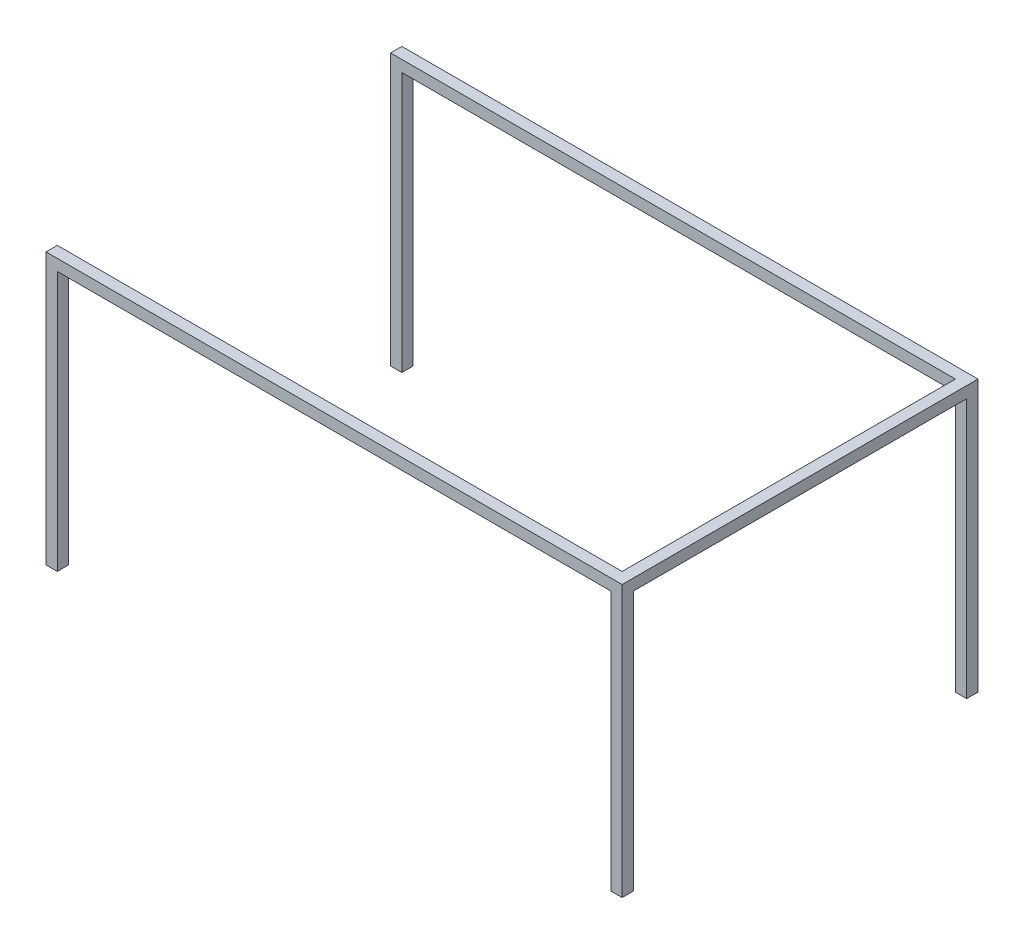
ISO-10303-21;
HEADER;
FILE_DESCRIPTION(('STEP AP214'),'2;1');
FILE_NAME('part.step','',(''),(''),'','','');
FILE_SCHEMA(('AUTOMOTIVE_DESIGN { 1 0 10303 214 1 1 1 1 }'));
ENDSEC;
DATA;
#1=APPLICATION_CONTEXT('core data for automotive mechanical design processes');
#2=APPLICATION_PROTOCOL_DEFINITION('international standard','automotive_design',2000,#1);
#3=PRODUCT_CONTEXT('',#1,'mechanical');
#4=PRODUCT('Part','Part','',(#3));
#5=PRODUCT_RELATED_PRODUCT_CATEGORY('part','',(#4));
#6=PRODUCT_DEFINITION_FORMATION('','',#4);
#7=PRODUCT_DEFINITION_CONTEXT('part definition',#1,'design');
#8=PRODUCT_DEFINITION('design','',#6,#7);
#9=PRODUCT_DEFINITION_SHAPE('','',#8);
#10=(LENGTH_UNIT() NAMED_UNIT(*) SI_UNIT(.MILLI.,.METRE.));
#11=(NAMED_UNIT(*) PLANE_ANGLE_UNIT() SI_UNIT($,.RADIAN.));
#12=(NAMED_UNIT(*) SI_UNIT($,.STERADIAN.) SOLID_ANGLE_UNIT());
#13=UNCERTAINTY_MEASURE_WITH_UNIT(LENGTH_MEASURE(1.E-05),#10,'distance_accuracy_value','');
#14=(GEOMETRIC_REPRESENTATION_CONTEXT(3) GLOBAL_UNCERTAINTY_ASSIGNED_CONTEXT((#13)) GLOBAL_UNIT_ASSIGNED_CONTEXT((#10,
#11,#12)) REPRESENTATION_CONTEXT('',''));
#15=CARTESIAN_POINT('',(0.,0.,0.));
#16=DIRECTION('',(0.,0.,1.));
#17=DIRECTION('',(1.,0.,0.));
#18=AXIS2_PLACEMENT_3D('',#15,#16,#17);
#19=CARTESIAN_POINT('',(0.,0.,0.));
#20=DIRECTION('',(0.,1.,0.));
#21=DIRECTION('',(0.,0.,1.));
#22=AXIS2_PLACEMENT_3D('',#19,#20,#21);
#23=PLANE('',#22);
#24=DIRECTION('',(0.,0.,1.));
#25=VECTOR('',#24,1.);
#26=CARTESIAN_POINT('',(774.7,0.,0.));
#27=LINE('',#26,#25);
#28=CARTESIAN_POINT('',(774.7,0.,-374.65));
#29=VERTEX_POINT('',#28);
#30=CARTESIAN_POINT('',(774.7,0.,374.65));
#31=VERTEX_POINT('',#30);
#32=EDGE_CURVE('E249',#29,#31,#27,.T.);
#33=ORIENTED_EDGE('',*,*,#32,.T.);
#34=DIRECTION('',(-1.,0.,0.));
#35=VECTOR('',#34,1.);
#36=CARTESIAN_POINT('',(774.7,0.,374.65));
#37=LINE('',#36,#35);
#38=CARTESIAN_POINT('',(749.3,0.,374.65));
#39=VERTEX_POINT('',#38);
#40=EDGE_CURVE('E241',#31,#39,#37,.T.);
#41=ORIENTED_EDGE('',*,*,#40,.T.);
#42=DIRECTION('',(0.,0.,-1.));
#43=VECTOR('',#42,1.);
#44=CARTESIAN_POINT('',(749.3,0.,0.));
#45=LINE('',#44,#43);
#46=CARTESIAN_POINT('',(749.3,0.,-374.65));
#47=VERTEX_POINT('',#46);
#48=EDGE_CURVE('E226',#39,#47,#45,.T.);
#49=ORIENTED_EDGE('',*,*,#48,.T.);
#50=DIRECTION('',(1.,0.,0.));
#51=VECTOR('',#50,1.);
#52=CARTESIAN_POINT('',(774.7,0.,-374.65));
#53=LINE('',#52,#51);
#54=EDGE_CURVE('E201',#47,#29,#53,.T.);
#55=ORIENTED_EDGE('',*,*,#54,.T.);
#56=EDGE_LOOP('',(#33,#41,#49,#55));
#57=FACE_BOUND('',#56,.T.);
#58=ADVANCED_FACE('F72',(#57),#23,.F.);
#59=DIRECTION('',(1.,0.,0.));
#60=VECTOR('',#59,1.);
#61=CARTESIAN_POINT('',(0.,0.,-400.05));
#62=LINE('',#61,#60);
#63=CARTESIAN_POINT('',(-495.3,0.,-400.05));
#64=VERTEX_POINT('',#63);
#65=CARTESIAN_POINT('',(749.3,0.,-400.05));
#66=VERTEX_POINT('',#65);
#67=EDGE_CURVE('E218',#64,#66,#62,.T.);
#68=ORIENTED_EDGE('',*,*,#67,.T.);
#69=DIRECTION('',(0.,0.,1.));
#70=VECTOR('',#69,1.);
#71=CARTESIAN_POINT('',(749.3,0.,-400.05));
#72=LINE('',#71,#70);
#73=EDGE_CURVE('E198',#66,#47,#72,.T.);
#74=ORIENTED_EDGE('',*,*,#73,.T.);
#75=DIRECTION('',(-1.,0.,0.));
#76=VECTOR('',#75,1.);
#77=CARTESIAN_POINT('',(749.3,0.,-374.65));
#78=LINE('',#77,#76);
#79=CARTESIAN_POINT('',(-495.3,0.,-374.65));
#80=VERTEX_POINT('',#79);
#81=EDGE_CURVE('E220',#47,#80,#78,.T.);
#82=ORIENTED_EDGE('',*,*,#81,.T.);
#83=DIRECTION('',(0.,0.,-1.));
#84=VECTOR('',#83,1.);
#85=CARTESIAN_POINT('',(-495.3,0.,-400.05));
#86=LINE('',#85,#84);
#87=EDGE_CURVE('E219',#80,#64,#86,.T.);
#88=ORIENTED_EDGE('',*,*,#87,.T.);
#89=EDGE_LOOP('',(#68,#74,#82,#88));
#90=FACE_BOUND('',#89,.T.);
#91=ADVANCED_FACE('F212',(#90),#23,.F.);
#92=CARTESIAN_POINT('',(-520.7,25.4,0.));
#93=DIRECTION('',(1.,0.,0.));
#94=DIRECTION('',(0.,0.,-1.));
#95=AXIS2_PLACEMENT_3D('',#92,#93,#94);
#96=PLANE('',#95);
#97=DIRECTION('',(0.,-1.,0.));
#98=VECTOR('',#97,1.);
#99=CARTESIAN_POINT('',(-520.7,25.4,374.65));
#100=LINE('',#99,#98);
#101=CARTESIAN_POINT('',(-520.7,25.4,374.65));
#102=VERTEX_POINT('',#101);
#103=CARTESIAN_POINT('',(-520.7,-584.2,374.65));
#104=VERTEX_POINT('',#103);
#105=EDGE_CURVE('E79',#102,#104,#100,.T.);
#106=ORIENTED_EDGE('',*,*,#105,.T.);
#107=DIRECTION('',(0.,0.,1.));
#108=VECTOR('',#107,1.);
#109=CARTESIAN_POINT('',(-520.7,-584.2,400.05));
#110=LINE('',#109,#108);
#111=CARTESIAN_POINT('',(-520.7,-584.2,400.05));
#112=VERTEX_POINT('',#111);
#113=EDGE_CURVE('E309',#104,#112,#110,.T.);
#114=ORIENTED_EDGE('',*,*,#113,.T.);
#115=DIRECTION('',(0.,-1.,0.));
#116=VECTOR('',#115,1.);
#117=CARTESIAN_POINT('',(-520.7,25.4,400.05));
#118=LINE('',#117,#116);
#119=CARTESIAN_POINT('',(-520.7,25.4,400.05));
#120=VERTEX_POINT('',#119);
#121=EDGE_CURVE('E256',#120,#112,#118,.T.);
#122=ORIENTED_EDGE('',*,*,#121,.F.);
#123=DIRECTION('',(0.,0.,1.));
#124=VECTOR('',#123,1.);
#125=CARTESIAN_POINT('',(-520.7,25.4,0.));
#126=LINE('',#125,#124);
#127=EDGE_CURVE('E246',#102,#120,#126,.T.);
#128=ORIENTED_EDGE('',*,*,#127,.F.);
#129=EDGE_LOOP('',(#106,#114,#122,#128));
#130=FACE_BOUND('',#129,.T.);
#131=ADVANCED_FACE('F384',(#130),#96,.F.);
#132=CARTESIAN_POINT('',(0.,25.4,400.05));
#133=DIRECTION('',(0.,0.,1.));
#134=DIRECTION('',(1.,0.,0.));
#135=AXIS2_PLACEMENT_3D('',#132,#133,#134);
#136=PLANE('',#135);
#137=DIRECTION('',(-1.,0.,0.));
#138=VECTOR('',#137,1.);
#139=CARTESIAN_POINT('',(0.,0.,400.05));
#140=LINE('',#139,#138);
#141=CARTESIAN_POINT('',(749.3,0.,400.05));
#142=VERTEX_POINT('',#141);
#143=CARTESIAN_POINT('',(-495.3,0.,400.05));
#144=VERTEX_POINT('',#143);
#145=EDGE_CURVE('E275',#142,#144,#140,.T.);
#146=ORIENTED_EDGE('',*,*,#145,.F.);
#147=DIRECTION('',(0.,1.,0.));
#148=VECTOR('',#147,1.);
#149=CARTESIAN_POINT('',(749.3,-584.2,400.05));
#150=LINE('',#149,#148);
#151=CARTESIAN_POINT('',(749.3,-584.2,400.05));
#152=VERTEX_POINT('',#151);
#153=EDGE_CURVE('E86',#152,#142,#150,.T.);
#154=ORIENTED_EDGE('',*,*,#153,.F.);
#155=DIRECTION('',(1.,0.,0.));
#156=VECTOR('',#155,1.);
#157=CARTESIAN_POINT('',(774.7,-584.2,400.05));
#158=LINE('',#157,#156);
#159=CARTESIAN_POINT('',(774.7,-584.2,400.05));
#160=VERTEX_POINT('',#159);
#161=EDGE_CURVE('E297',#152,#160,#158,.T.);
#162=ORIENTED_EDGE('',*,*,#161,.T.);
#163=DIRECTION('',(0.,-1.,0.));
#164=VECTOR('',#163,1.);
#165=CARTESIAN_POINT('',(774.7,25.4,400.05));
#166=LINE('',#165,#164);
#167=CARTESIAN_POINT('',(774.7,25.4,400.05));
#168=VERTEX_POINT('',#167);
#169=EDGE_CURVE('E258',#168,#160,#166,.T.);
#170=ORIENTED_EDGE('',*,*,#169,.F.);
#171=DIRECTION('',(-1.,0.,0.));
#172=VECTOR('',#171,1.);
#173=CARTESIAN_POINT('',(0.,25.4,400.05));
#174=LINE('',#173,#172);
#175=EDGE_CURVE('E341',#168,#120,#174,.T.);
#176=ORIENTED_EDGE('',*,*,#175,.T.);
#177=ORIENTED_EDGE('',*,*,#121,.T.);
#178=DIRECTION('',(1.,0.,0.));
#179=VECTOR('',#178,1.);
#180=CARTESIAN_POINT('',(-520.7,-584.2,400.05));
#181=LINE('',#180,#179);
#182=CARTESIAN_POINT('',(-495.3,-584.2,400.05));
#183=VERTEX_POINT('',#182);
#184=EDGE_CURVE('E316',#112,#183,#181,.T.);
#185=ORIENTED_EDGE('',*,*,#184,.T.);
#186=DIRECTION('',(0.,1.,0.));
#187=VECTOR('',#186,1.);
#188=CARTESIAN_POINT('',(-495.3,-584.2,400.05));
#189=LINE('',#188,#187);
#190=EDGE_CURVE('E306',#183,#144,#189,.T.);
#191=ORIENTED_EDGE('',*,*,#190,.T.);
#192=EDGE_LOOP('',(#146,#154,#162,#170,#176,#177,#185,#191));
#193=FACE_BOUND('',#192,.T.);
#194=ADVANCED_FACE('F398',(#193),#136,.T.);
#195=CARTESIAN_POINT('',(774.7,25.4,0.));
#196=DIRECTION('',(1.,0.,0.));
#197=DIRECTION('',(0.,0.,-1.));
#198=AXIS2_PLACEMENT_3D('',#195,#196,#197);
#199=PLANE('',#198);
#200=ORIENTED_EDGE('',*,*,#32,.F.);
#201=DIRECTION('',(0.,1.,0.));
#202=VECTOR('',#201,1.);
#203=CARTESIAN_POINT('',(774.7,-584.2,-374.65));
#204=LINE('',#203,#202);
#205=CARTESIAN_POINT('',(774.7,-584.2,-374.65));
#206=VERTEX_POINT('',#205);
#207=EDGE_CURVE('E96',#206,#29,#204,.T.);
#208=ORIENTED_EDGE('',*,*,#207,.F.);
#209=DIRECTION('',(0.,0.,-1.));
#210=VECTOR('',#209,1.);
#211=CARTESIAN_POINT('',(774.7,-584.2,-400.05));
#212=LINE('',#211,#210);
#213=CARTESIAN_POINT('',(774.7,-584.2,-400.05));
#214=VERTEX_POINT('',#213);
#215=EDGE_CURVE('E207',#206,#214,#212,.T.);
#216=ORIENTED_EDGE('',*,*,#215,.T.);
#217=DIRECTION('',(0.,-1.,0.));
#218=VECTOR('',#217,1.);
#219=CARTESIAN_POINT('',(774.7,25.4,-400.05));
#220=LINE('',#219,#218);
#221=CARTESIAN_POINT('',(774.7,25.4,-400.05));
#222=VERTEX_POINT('',#221);
#223=EDGE_CURVE('E255',#222,#214,#220,.T.);
#224=ORIENTED_EDGE('',*,*,#223,.F.);
#225=DIRECTION('',(0.,0.,1.));
#226=VECTOR('',#225,1.);
#227=CARTESIAN_POINT('',(774.7,25.4,0.));
#228=LINE('',#227,#226);
#229=EDGE_CURVE('E343',#222,#168,#228,.T.);
#230=ORIENTED_EDGE('',*,*,#229,.T.);
#231=ORIENTED_EDGE('',*,*,#169,.T.);
#232=DIRECTION('',(0.,0.,-1.));
#233=VECTOR('',#232,1.);
#234=CARTESIAN_POINT('',(774.7,-584.2,400.05));
#235=LINE('',#234,#233);
#236=CARTESIAN_POINT('',(774.7,-584.2,374.65));
#237=VERTEX_POINT('',#236);
#238=EDGE_CURVE('E287',#160,#237,#235,.T.);
#239=ORIENTED_EDGE('',*,*,#238,.T.);
#240=DIRECTION('',(0.,1.,0.));
#241=VECTOR('',#240,1.);
#242=CARTESIAN_POINT('',(774.7,-584.2,374.65));
#243=LINE('',#242,#241);
#244=EDGE_CURVE('E284',#237,#31,#243,.T.);
#245=ORIENTED_EDGE('',*,*,#244,.T.);
#246=EDGE_LOOP('',(#200,#208,#216,#224,#230,#231,#239,#245));
#247=FACE_BOUND('',#246,.T.);
#248=ADVANCED_FACE('F281',(#247),#199,.T.);
#249=CARTESIAN_POINT('',(0.,25.4,-400.05));
#250=DIRECTION('',(0.,0.,-1.));
#251=DIRECTION('',(-1.,0.,0.));
#252=AXIS2_PLACEMENT_3D('',#249,#250,#251);
#253=PLANE('',#252);
#254=ORIENTED_EDGE('',*,*,#67,.F.);
#255=DIRECTION('',(0.,1.,0.));
#256=VECTOR('',#255,1.);
#257=CARTESIAN_POINT('',(-495.3,-584.2,-400.05));
#258=LINE('',#257,#256);
#259=CARTESIAN_POINT('',(-495.3,-584.2,-400.05));
#260=VERTEX_POINT('',#259);
#261=EDGE_CURVE('E240',#260,#64,#258,.T.);
#262=ORIENTED_EDGE('',*,*,#261,.F.);
#263=DIRECTION('',(-1.,0.,0.));
#264=VECTOR('',#263,1.);
#265=CARTESIAN_POINT('',(-520.7,-584.2,-400.05));
#266=LINE('',#265,#264);
#267=CARTESIAN_POINT('',(-520.7,-584.2,-400.05));
#268=VERTEX_POINT('',#267);
#269=EDGE_CURVE('E331',#260,#268,#266,.T.);
#270=ORIENTED_EDGE('',*,*,#269,.T.);
#271=DIRECTION('',(0.,-1.,0.));
#272=VECTOR('',#271,1.);
#273=CARTESIAN_POINT('',(-520.7,25.4,-400.05));
#274=LINE('',#273,#272);
#275=CARTESIAN_POINT('',(-520.7,25.4,-400.05));
#276=VERTEX_POINT('',#275);
#277=EDGE_CURVE('E73',#276,#268,#274,.T.);
#278=ORIENTED_EDGE('',*,*,#277,.F.);
#279=DIRECTION('',(1.,0.,0.));
#280=VECTOR('',#279,1.);
#281=CARTESIAN_POINT('',(0.,25.4,-400.05));
#282=LINE('',#281,#280);
#283=EDGE_CURVE('E347',#276,#222,#282,.T.);
#284=ORIENTED_EDGE('',*,*,#283,.T.);
#285=ORIENTED_EDGE('',*,*,#223,.T.);
#286=DIRECTION('',(-1.,0.,0.));
#287=VECTOR('',#286,1.);
#288=CARTESIAN_POINT('',(774.7,-584.2,-400.05));
#289=LINE('',#288,#287);
#290=CARTESIAN_POINT('',(749.3,-584.2,-400.05));
#291=VERTEX_POINT('',#290);
#292=EDGE_CURVE('E359',#214,#291,#289,.T.);
#293=ORIENTED_EDGE('',*,*,#292,.T.);
#294=DIRECTION('',(0.,1.,0.));
#295=VECTOR('',#294,1.);
#296=CARTESIAN_POINT('',(749.3,-584.2,-400.05));
#297=LINE('',#296,#295);
#298=EDGE_CURVE('E203',#291,#66,#297,.T.);
#299=ORIENTED_EDGE('',*,*,#298,.T.);
#300=EDGE_LOOP('',(#254,#262,#270,#278,#284,#285,#293,#299));
#301=FACE_BOUND('',#300,.T.);
#302=ADVANCED_FACE('F349',(#301),#253,.T.);
#303=CARTESIAN_POINT('',(749.3,25.4,0.));
#304=DIRECTION('',(-1.,0.,0.));
#305=DIRECTION('',(0.,0.,1.));
#306=AXIS2_PLACEMENT_3D('',#303,#304,#305);
#307=PLANE('',#306);
#308=DIRECTION('',(0.,1.,0.));
#309=VECTOR('',#308,1.);
#310=CARTESIAN_POINT('',(749.3,25.4,-374.65));
#311=LINE('',#310,#309);
#312=CARTESIAN_POINT('',(749.3,25.4,-374.65));
#313=VERTEX_POINT('',#312);
#314=EDGE_CURVE('E12',#47,#313,#311,.T.);
#315=ORIENTED_EDGE('',*,*,#314,.F.);
#316=ORIENTED_EDGE('',*,*,#48,.F.);
#317=DIRECTION('',(0.,-1.,0.));
#318=VECTOR('',#317,1.);
#319=CARTESIAN_POINT('',(749.3,25.4,374.65));
#320=LINE('',#319,#318);
#321=CARTESIAN_POINT('',(749.3,25.4,374.65));
#322=VERTEX_POINT('',#321);
#323=EDGE_CURVE('E252',#322,#39,#320,.T.);
#324=ORIENTED_EDGE('',*,*,#323,.F.);
#325=DIRECTION('',(0.,0.,-1.));
#326=VECTOR('',#325,1.);
#327=CARTESIAN_POINT('',(749.3,25.4,0.));
#328=LINE('',#327,#326);
#329=EDGE_CURVE('E227',#322,#313,#328,.T.);
#330=ORIENTED_EDGE('',*,*,#329,.T.);
#331=EDGE_LOOP('',(#315,#316,#324,#330));
#332=FACE_BOUND('',#331,.T.);
#333=ADVANCED_FACE('F223',(#332),#307,.T.);
#334=CARTESIAN_POINT('',(0.,25.4,374.65));
#335=DIRECTION('',(0.,0.,1.));
#336=DIRECTION('',(1.,0.,0.));
#337=AXIS2_PLACEMENT_3D('',#334,#335,#336);
#338=PLANE('',#337);
#339=DIRECTION('',(-1.,0.,0.));
#340=VECTOR('',#339,1.);
#341=CARTESIAN_POINT('',(0.,0.,374.65));
#342=LINE('',#341,#340);
#343=CARTESIAN_POINT('',(-495.3,0.,374.65));
#344=VERTEX_POINT('',#343);
#345=EDGE_CURVE('E266',#39,#344,#342,.T.);
#346=ORIENTED_EDGE('',*,*,#345,.T.);
#347=DIRECTION('',(0.,1.,0.));
#348=VECTOR('',#347,1.);
#349=CARTESIAN_POINT('',(-495.3,-584.2,374.65));
#350=LINE('',#349,#348);
#351=CARTESIAN_POINT('',(-495.3,-584.2,374.65));
#352=VERTEX_POINT('',#351);
#353=EDGE_CURVE('E313',#352,#344,#350,.T.);
#354=ORIENTED_EDGE('',*,*,#353,.F.);
#355=DIRECTION('',(-1.,0.,0.));
#356=VECTOR('',#355,1.);
#357=CARTESIAN_POINT('',(-520.7,-584.2,374.65));
#358=LINE('',#357,#356);
#359=EDGE_CURVE('E317',#352,#104,#358,.T.);
#360=ORIENTED_EDGE('',*,*,#359,.T.);
#361=ORIENTED_EDGE('',*,*,#105,.F.);
#362=DIRECTION('',(-1.,0.,0.));
#363=VECTOR('',#362,1.);
#364=CARTESIAN_POINT('',(0.,25.4,374.65));
#365=LINE('',#364,#363);
#366=EDGE_CURVE('E242',#322,#102,#365,.T.);
#367=ORIENTED_EDGE('',*,*,#366,.F.);
#368=ORIENTED_EDGE('',*,*,#323,.T.);
#369=EDGE_LOOP('',(#346,#354,#360,#361,#367,#368));
#370=FACE_BOUND('',#369,.T.);
#371=ADVANCED_FACE('F386',(#370),#338,.F.);
#372=ORIENTED_EDGE('',*,*,#145,.T.);
#373=DIRECTION('',(0.,0.,-1.));
#374=VECTOR('',#373,1.);
#375=CARTESIAN_POINT('',(-495.3,0.,400.05));
#376=LINE('',#375,#374);
#377=EDGE_CURVE('E311',#144,#344,#376,.T.);
#378=ORIENTED_EDGE('',*,*,#377,.T.);
#379=ORIENTED_EDGE('',*,*,#345,.F.);
#380=DIRECTION('',(0.,0.,1.));
#381=VECTOR('',#380,1.);
#382=CARTESIAN_POINT('',(749.3,0.,400.05));
#383=LINE('',#382,#381);
#384=EDGE_CURVE('E293',#39,#142,#383,.T.);
#385=ORIENTED_EDGE('',*,*,#384,.T.);
#386=EDGE_LOOP('',(#372,#378,#379,#385));
#387=FACE_BOUND('',#386,.T.);
#388=ADVANCED_FACE('F379',(#387),#23,.F.);
#389=CARTESIAN_POINT('',(0.,25.4,0.));
#390=DIRECTION('',(0.,1.,0.));
#391=DIRECTION('',(0.,0.,1.));
#392=AXIS2_PLACEMENT_3D('',#389,#390,#391);
#393=PLANE('',#392);
#394=ORIENTED_EDGE('',*,*,#366,.T.);
#395=ORIENTED_EDGE('',*,*,#127,.T.);
#396=ORIENTED_EDGE('',*,*,#175,.F.);
#397=ORIENTED_EDGE('',*,*,#229,.F.);
#398=ORIENTED_EDGE('',*,*,#283,.F.);
#399=DIRECTION('',(0.,0.,-1.));
#400=VECTOR('',#399,1.);
#401=CARTESIAN_POINT('',(-520.7,25.4,-374.65));
#402=LINE('',#401,#400);
#403=CARTESIAN_POINT('',(-520.7,25.4,-374.65));
#404=VERTEX_POINT('',#403);
#405=EDGE_CURVE('E237',#404,#276,#402,.T.);
#406=ORIENTED_EDGE('',*,*,#405,.F.);
#407=DIRECTION('',(-1.,0.,0.));
#408=VECTOR('',#407,1.);
#409=CARTESIAN_POINT('',(749.3,25.4,-374.65));
#410=LINE('',#409,#408);
#411=EDGE_CURVE('E263',#313,#404,#410,.T.);
#412=ORIENTED_EDGE('',*,*,#411,.F.);
#413=ORIENTED_EDGE('',*,*,#329,.F.);
#414=EDGE_LOOP('',(#394,#395,#396,#397,#398,#406,#412,#413));
#415=FACE_BOUND('',#414,.T.);
#416=ADVANCED_FACE('F354',(#415),#393,.T.);
#417=CARTESIAN_POINT('',(-520.7,25.4,-374.65));
#418=DIRECTION('',(-1.,0.,0.));
#419=DIRECTION('',(0.,0.,1.));
#420=AXIS2_PLACEMENT_3D('',#417,#418,#419);
#421=PLANE('',#420);
#422=ORIENTED_EDGE('',*,*,#277,.T.);
#423=DIRECTION('',(0.,0.,1.));
#424=VECTOR('',#423,1.);
#425=CARTESIAN_POINT('',(-520.7,-584.2,-400.05));
#426=LINE('',#425,#424);
#427=CARTESIAN_POINT('',(-520.7,-584.2,-374.65));
#428=VERTEX_POINT('',#427);
#429=EDGE_CURVE('E330',#268,#428,#426,.T.);
#430=ORIENTED_EDGE('',*,*,#429,.T.);
#431=DIRECTION('',(0.,-1.,0.));
#432=VECTOR('',#431,1.);
#433=CARTESIAN_POINT('',(-520.7,25.4,-374.65));
#434=LINE('',#433,#432);
#435=EDGE_CURVE('E262',#404,#428,#434,.T.);
#436=ORIENTED_EDGE('',*,*,#435,.F.);
#437=ORIENTED_EDGE('',*,*,#405,.T.);
#438=EDGE_LOOP('',(#422,#430,#436,#437));
#439=FACE_BOUND('',#438,.T.);
#440=ADVANCED_FACE('F71',(#439),#421,.T.);
#441=CARTESIAN_POINT('',(749.3,25.4,-374.65));
#442=DIRECTION('',(0.,0.,1.));
#443=DIRECTION('',(1.,0.,0.));
#444=AXIS2_PLACEMENT_3D('',#441,#442,#443);
#445=PLANE('',#444);
#446=ORIENTED_EDGE('',*,*,#81,.F.);
#447=ORIENTED_EDGE('',*,*,#314,.T.);
#448=ORIENTED_EDGE('',*,*,#411,.T.);
#449=ORIENTED_EDGE('',*,*,#435,.T.);
#450=DIRECTION('',(1.,0.,0.));
#451=VECTOR('',#450,1.);
#452=CARTESIAN_POINT('',(-520.7,-584.2,-374.65));
#453=LINE('',#452,#451);
#454=CARTESIAN_POINT('',(-495.3,-584.2,-374.65));
#455=VERTEX_POINT('',#454);
#456=EDGE_CURVE('E328',#428,#455,#453,.T.);
#457=ORIENTED_EDGE('',*,*,#456,.T.);
#458=DIRECTION('',(0.,1.,0.));
#459=VECTOR('',#458,1.);
#460=CARTESIAN_POINT('',(-495.3,-584.2,-374.65));
#461=LINE('',#460,#459);
#462=EDGE_CURVE('E233',#455,#80,#461,.T.);
#463=ORIENTED_EDGE('',*,*,#462,.T.);
#464=EDGE_LOOP('',(#446,#447,#448,#449,#457,#463));
#465=FACE_BOUND('',#464,.T.);
#466=ADVANCED_FACE('F232',(#465),#445,.T.);
#467=CARTESIAN_POINT('',(-495.3,-584.2,-400.05));
#468=DIRECTION('',(1.,0.,0.));
#469=DIRECTION('',(0.,0.,-1.));
#470=AXIS2_PLACEMENT_3D('',#467,#468,#469);
#471=PLANE('',#470);
#472=ORIENTED_EDGE('',*,*,#87,.F.);
#473=ORIENTED_EDGE('',*,*,#462,.F.);
#474=DIRECTION('',(0.,0.,-1.));
#475=VECTOR('',#474,1.);
#476=CARTESIAN_POINT('',(-495.3,-584.2,-400.05));
#477=LINE('',#476,#475);
#478=EDGE_CURVE('E332',#455,#260,#477,.T.);
#479=ORIENTED_EDGE('',*,*,#478,.T.);
#480=ORIENTED_EDGE('',*,*,#261,.T.);
#481=EDGE_LOOP('',(#472,#473,#479,#480));
#482=FACE_BOUND('',#481,.T.);
#483=ADVANCED_FACE('F427',(#482),#471,.T.);
#484=CARTESIAN_POINT('',(0.,-584.2,0.));
#485=DIRECTION('',(0.,1.,0.));
#486=DIRECTION('',(0.,0.,1.));
#487=AXIS2_PLACEMENT_3D('',#484,#485,#486);
#488=PLANE('',#487);
#489=ORIENTED_EDGE('',*,*,#429,.F.);
#490=ORIENTED_EDGE('',*,*,#269,.F.);
#491=ORIENTED_EDGE('',*,*,#478,.F.);
#492=ORIENTED_EDGE('',*,*,#456,.F.);
#493=EDGE_LOOP('',(#489,#490,#491,#492));
#494=FACE_BOUND('',#493,.T.);
#495=ADVANCED_FACE('F426',(#494),#488,.F.);
#496=CARTESIAN_POINT('',(774.7,-584.2,-374.65));
#497=DIRECTION('',(0.,0.,1.));
#498=DIRECTION('',(1.,0.,0.));
#499=AXIS2_PLACEMENT_3D('',#496,#497,#498);
#500=PLANE('',#499);
#501=ORIENTED_EDGE('',*,*,#54,.F.);
#502=DIRECTION('',(0.,1.,0.));
#503=VECTOR('',#502,1.);
#504=CARTESIAN_POINT('',(749.3,-584.2,-374.65));
#505=LINE('',#504,#503);
#506=CARTESIAN_POINT('',(749.3,-584.2,-374.65));
#507=VERTEX_POINT('',#506);
#508=EDGE_CURVE('E194',#507,#47,#505,.T.);
#509=ORIENTED_EDGE('',*,*,#508,.F.);
#510=DIRECTION('',(1.,0.,0.));
#511=VECTOR('',#510,1.);
#512=CARTESIAN_POINT('',(774.7,-584.2,-374.65));
#513=LINE('',#512,#511);
#514=EDGE_CURVE('E365',#507,#206,#513,.T.);
#515=ORIENTED_EDGE('',*,*,#514,.T.);
#516=ORIENTED_EDGE('',*,*,#207,.T.);
#517=EDGE_LOOP('',(#501,#509,#515,#516));
#518=FACE_BOUND('',#517,.T.);
#519=ADVANCED_FACE('F204',(#518),#500,.T.);
#520=CARTESIAN_POINT('',(749.3,-584.2,-400.05));
#521=DIRECTION('',(-1.,0.,0.));
#522=DIRECTION('',(0.,0.,1.));
#523=AXIS2_PLACEMENT_3D('',#520,#521,#522);
#524=PLANE('',#523);
#525=ORIENTED_EDGE('',*,*,#73,.F.);
#526=ORIENTED_EDGE('',*,*,#298,.F.);
#527=DIRECTION('',(0.,0.,1.));
#528=VECTOR('',#527,1.);
#529=CARTESIAN_POINT('',(749.3,-584.2,-400.05));
#530=LINE('',#529,#528);
#531=EDGE_CURVE('E200',#291,#507,#530,.T.);
#532=ORIENTED_EDGE('',*,*,#531,.T.);
#533=ORIENTED_EDGE('',*,*,#508,.T.);
#534=EDGE_LOOP('',(#525,#526,#532,#533));
#535=FACE_BOUND('',#534,.T.);
#536=ADVANCED_FACE('F193',(#535),#524,.T.);
#537=CARTESIAN_POINT('',(0.,-584.2,0.));
#538=DIRECTION('',(0.,-1.,0.));
#539=DIRECTION('',(0.,0.,-1.));
#540=AXIS2_PLACEMENT_3D('',#537,#538,#539);
#541=PLANE('',#540);
#542=ORIENTED_EDGE('',*,*,#215,.F.);
#543=ORIENTED_EDGE('',*,*,#514,.F.);
#544=ORIENTED_EDGE('',*,*,#531,.F.);
#545=ORIENTED_EDGE('',*,*,#292,.F.);
#546=EDGE_LOOP('',(#542,#543,#544,#545));
#547=FACE_BOUND('',#546,.T.);
#548=ADVANCED_FACE('F368',(#547),#541,.T.);
#549=CARTESIAN_POINT('',(749.3,-584.2,400.05));
#550=DIRECTION('',(-1.,0.,0.));
#551=DIRECTION('',(0.,0.,1.));
#552=AXIS2_PLACEMENT_3D('',#549,#550,#551);
#553=PLANE('',#552);
#554=ORIENTED_EDGE('',*,*,#384,.F.);
#555=DIRECTION('',(0.,1.,0.));
#556=VECTOR('',#555,1.);
#557=CARTESIAN_POINT('',(749.3,-584.2,374.65));
#558=LINE('',#557,#556);
#559=CARTESIAN_POINT('',(749.3,-584.2,374.65));
#560=VERTEX_POINT('',#559);
#561=EDGE_CURVE('E295',#560,#39,#558,.T.);
#562=ORIENTED_EDGE('',*,*,#561,.F.);
#563=DIRECTION('',(0.,0.,1.));
#564=VECTOR('',#563,1.);
#565=CARTESIAN_POINT('',(749.3,-584.2,400.05));
#566=LINE('',#565,#564);
#567=EDGE_CURVE('E292',#560,#152,#566,.T.);
#568=ORIENTED_EDGE('',*,*,#567,.T.);
#569=ORIENTED_EDGE('',*,*,#153,.T.);
#570=EDGE_LOOP('',(#554,#562,#568,#569));
#571=FACE_BOUND('',#570,.T.);
#572=ADVANCED_FACE('F366',(#571),#553,.T.);
#573=CARTESIAN_POINT('',(774.7,-584.2,374.65));
#574=DIRECTION('',(0.,0.,-1.));
#575=DIRECTION('',(-1.,0.,0.));
#576=AXIS2_PLACEMENT_3D('',#573,#574,#575);
#577=PLANE('',#576);
#578=ORIENTED_EDGE('',*,*,#40,.F.);
#579=ORIENTED_EDGE('',*,*,#244,.F.);
#580=DIRECTION('',(-1.,0.,0.));
#581=VECTOR('',#580,1.);
#582=CARTESIAN_POINT('',(774.7,-584.2,374.65));
#583=LINE('',#582,#581);
#584=EDGE_CURVE('E304',#237,#560,#583,.T.);
#585=ORIENTED_EDGE('',*,*,#584,.T.);
#586=ORIENTED_EDGE('',*,*,#561,.T.);
#587=EDGE_LOOP('',(#578,#579,#585,#586));
#588=FACE_BOUND('',#587,.T.);
#589=ADVANCED_FACE('F294',(#588),#577,.T.);
#590=CARTESIAN_POINT('',(0.,-584.2,0.));
#591=DIRECTION('',(0.,-1.,0.));
#592=DIRECTION('',(0.,0.,-1.));
#593=AXIS2_PLACEMENT_3D('',#590,#591,#592);
#594=PLANE('',#593);
#595=ORIENTED_EDGE('',*,*,#161,.F.);
#596=ORIENTED_EDGE('',*,*,#567,.F.);
#597=ORIENTED_EDGE('',*,*,#584,.F.);
#598=ORIENTED_EDGE('',*,*,#238,.F.);
#599=EDGE_LOOP('',(#595,#596,#597,#598));
#600=FACE_BOUND('',#599,.T.);
#601=ADVANCED_FACE('F415',(#600),#594,.T.);
#602=CARTESIAN_POINT('',(-495.3,-584.2,400.05));
#603=DIRECTION('',(1.,0.,0.));
#604=DIRECTION('',(0.,0.,-1.));
#605=AXIS2_PLACEMENT_3D('',#602,#603,#604);
#606=PLANE('',#605);
#607=ORIENTED_EDGE('',*,*,#377,.F.);
#608=ORIENTED_EDGE('',*,*,#190,.F.);
#609=DIRECTION('',(0.,0.,-1.));
#610=VECTOR('',#609,1.);
#611=CARTESIAN_POINT('',(-495.3,-584.2,400.05));
#612=LINE('',#611,#610);
#613=EDGE_CURVE('E325',#183,#352,#612,.T.);
#614=ORIENTED_EDGE('',*,*,#613,.T.);
#615=ORIENTED_EDGE('',*,*,#353,.T.);
#616=EDGE_LOOP('',(#607,#608,#614,#615));
#617=FACE_BOUND('',#616,.T.);
#618=ADVANCED_FACE('F404',(#617),#606,.T.);
#619=CARTESIAN_POINT('',(0.,-584.2,0.));
#620=DIRECTION('',(0.,1.,0.));
#621=DIRECTION('',(0.,0.,1.));
#622=AXIS2_PLACEMENT_3D('',#619,#620,#621);
#623=PLANE('',#622);
#624=ORIENTED_EDGE('',*,*,#184,.F.);
#625=ORIENTED_EDGE('',*,*,#113,.F.);
#626=ORIENTED_EDGE('',*,*,#359,.F.);
#627=ORIENTED_EDGE('',*,*,#613,.F.);
#628=EDGE_LOOP('',(#624,#625,#626,#627));
#629=FACE_BOUND('',#628,.T.);
#630=ADVANCED_FACE('F408',(#629),#623,.F.);
#631=CLOSED_SHELL('',(#58,#91,#131,#194,#248,#302,#333,#371,#388,#416,#440,#466,#483,#495,#519,
#536,#548,#572,#589,#601,#618,#630));
#632=MANIFOLD_SOLID_BREP('B2',#631);
#633=ADVANCED_BREP_SHAPE_REPRESENTATION('',(#18,#632),#14);
#634=SHAPE_DEFINITION_REPRESENTATION(#9,#633);
ENDSEC;
END-ISO-10303-21;
